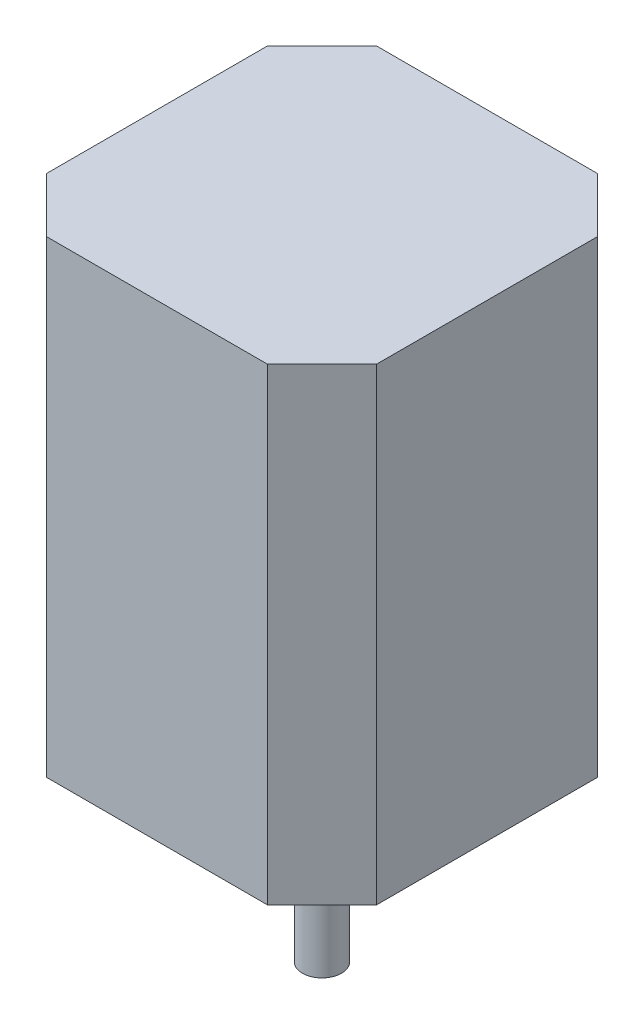
ISO-10303-21;
HEADER;
FILE_DESCRIPTION(('STEP AP214'),'2;1');
FILE_NAME('part.step','',(''),(''),'','','');
FILE_SCHEMA(('AUTOMOTIVE_DESIGN { 1 0 10303 214 1 1 1 1 }'));
ENDSEC;
DATA;
#1=APPLICATION_CONTEXT('core data for automotive mechanical design processes');
#2=APPLICATION_PROTOCOL_DEFINITION('international standard','automotive_design',2000,#1);
#3=PRODUCT_CONTEXT('',#1,'mechanical');
#4=PRODUCT('Part','Part','',(#3));
#5=PRODUCT_RELATED_PRODUCT_CATEGORY('part','',(#4));
#6=PRODUCT_DEFINITION_FORMATION('','',#4);
#7=PRODUCT_DEFINITION_CONTEXT('part definition',#1,'design');
#8=PRODUCT_DEFINITION('design','',#6,#7);
#9=PRODUCT_DEFINITION_SHAPE('','',#8);
#10=(LENGTH_UNIT() NAMED_UNIT(*) SI_UNIT(.MILLI.,.METRE.));
#11=(NAMED_UNIT(*) PLANE_ANGLE_UNIT() SI_UNIT($,.RADIAN.));
#12=(NAMED_UNIT(*) SI_UNIT($,.STERADIAN.) SOLID_ANGLE_UNIT());
#13=UNCERTAINTY_MEASURE_WITH_UNIT(LENGTH_MEASURE(1.E-05),#10,'distance_accuracy_value','');
#14=(GEOMETRIC_REPRESENTATION_CONTEXT(3) GLOBAL_UNCERTAINTY_ASSIGNED_CONTEXT((#13)) GLOBAL_UNIT_ASSIGNED_CONTEXT((#10,
#11,#12)) REPRESENTATION_CONTEXT('',''));
#15=CARTESIAN_POINT('',(0.,0.,0.));
#16=DIRECTION('',(0.,0.,1.));
#17=DIRECTION('',(1.,0.,0.));
#18=AXIS2_PLACEMENT_3D('',#15,#16,#17);
#19=CARTESIAN_POINT('',(-14.15,60.,21.15));
#20=DIRECTION('',(0.,0.,-1.));
#21=DIRECTION('',(-1.,0.,0.));
#22=AXIS2_PLACEMENT_3D('',#19,#20,#21);
#23=PLANE('',#22);
#24=DIRECTION('',(1.,0.,0.));
#25=VECTOR('',#24,1.);
#26=CARTESIAN_POINT('',(-14.15,0.,21.15));
#27=LINE('',#26,#25);
#28=CARTESIAN_POINT('',(-14.15,0.,21.15));
#29=VERTEX_POINT('',#28);
#30=CARTESIAN_POINT('',(14.15,0.,21.15));
#31=VERTEX_POINT('',#30);
#32=EDGE_CURVE('E133',#29,#31,#27,.T.);
#33=ORIENTED_EDGE('',*,*,#32,.T.);
#34=DIRECTION('',(0.,-1.,0.));
#35=VECTOR('',#34,1.);
#36=CARTESIAN_POINT('',(14.15,60.,21.15));
#37=LINE('',#36,#35);
#38=CARTESIAN_POINT('',(14.15,60.,21.15));
#39=VERTEX_POINT('',#38);
#40=EDGE_CURVE('E37',#39,#31,#37,.T.);
#41=ORIENTED_EDGE('',*,*,#40,.F.);
#42=DIRECTION('',(1.,0.,0.));
#43=VECTOR('',#42,1.);
#44=CARTESIAN_POINT('',(-14.15,60.,21.15));
#45=LINE('',#44,#43);
#46=CARTESIAN_POINT('',(-14.15,60.,21.15));
#47=VERTEX_POINT('',#46);
#48=EDGE_CURVE('E148',#47,#39,#45,.T.);
#49=ORIENTED_EDGE('',*,*,#48,.F.);
#50=DIRECTION('',(0.,-1.,0.));
#51=VECTOR('',#50,1.);
#52=CARTESIAN_POINT('',(-14.15,60.,21.15));
#53=LINE('',#52,#51);
#54=EDGE_CURVE('E129',#47,#29,#53,.T.);
#55=ORIENTED_EDGE('',*,*,#54,.T.);
#56=EDGE_LOOP('',(#33,#41,#49,#55));
#57=FACE_BOUND('',#56,.T.);
#58=ADVANCED_FACE('F34',(#57),#23,.F.);
#59=CARTESIAN_POINT('',(14.15,60.,21.15));
#60=DIRECTION('',(-0.707106781186547,0.,-0.707106781186547));
#61=DIRECTION('',(-0.707106781186548,0.,0.707106781186548));
#62=AXIS2_PLACEMENT_3D('',#59,#60,#61);
#63=PLANE('',#62);
#64=DIRECTION('',(0.707106781186547,0.,-0.707106781186547));
#65=VECTOR('',#64,1.);
#66=CARTESIAN_POINT('',(14.15,0.,21.15));
#67=LINE('',#66,#65);
#68=CARTESIAN_POINT('',(21.15,0.,14.15));
#69=VERTEX_POINT('',#68);
#70=EDGE_CURVE('E136',#31,#69,#67,.T.);
#71=ORIENTED_EDGE('',*,*,#70,.T.);
#72=DIRECTION('',(0.,-1.,0.));
#73=VECTOR('',#72,1.);
#74=CARTESIAN_POINT('',(21.15,60.,14.15));
#75=LINE('',#74,#73);
#76=CARTESIAN_POINT('',(21.15,60.,14.15));
#77=VERTEX_POINT('',#76);
#78=EDGE_CURVE('E157',#77,#69,#75,.T.);
#79=ORIENTED_EDGE('',*,*,#78,.F.);
#80=DIRECTION('',(0.707106781186547,0.,-0.707106781186547));
#81=VECTOR('',#80,1.);
#82=CARTESIAN_POINT('',(14.15,60.,21.15));
#83=LINE('',#82,#81);
#84=EDGE_CURVE('E96',#39,#77,#83,.T.);
#85=ORIENTED_EDGE('',*,*,#84,.F.);
#86=ORIENTED_EDGE('',*,*,#40,.T.);
#87=EDGE_LOOP('',(#71,#79,#85,#86));
#88=FACE_BOUND('',#87,.T.);
#89=ADVANCED_FACE('F200',(#88),#63,.F.);
#90=CARTESIAN_POINT('',(21.15,60.,14.15));
#91=DIRECTION('',(-1.,0.,0.));
#92=DIRECTION('',(0.,0.,1.));
#93=AXIS2_PLACEMENT_3D('',#90,#91,#92);
#94=PLANE('',#93);
#95=DIRECTION('',(0.,0.,-1.));
#96=VECTOR('',#95,1.);
#97=CARTESIAN_POINT('',(21.15,0.,14.15));
#98=LINE('',#97,#96);
#99=CARTESIAN_POINT('',(21.15,0.,-14.15));
#100=VERTEX_POINT('',#99);
#101=EDGE_CURVE('E139',#69,#100,#98,.T.);
#102=ORIENTED_EDGE('',*,*,#101,.T.);
#103=DIRECTION('',(0.,-1.,0.));
#104=VECTOR('',#103,1.);
#105=CARTESIAN_POINT('',(21.15,60.,-14.15));
#106=LINE('',#105,#104);
#107=CARTESIAN_POINT('',(21.15,60.,-14.15));
#108=VERTEX_POINT('',#107);
#109=EDGE_CURVE('E155',#108,#100,#106,.T.);
#110=ORIENTED_EDGE('',*,*,#109,.F.);
#111=DIRECTION('',(0.,0.,-1.));
#112=VECTOR('',#111,1.);
#113=CARTESIAN_POINT('',(21.15,60.,14.15));
#114=LINE('',#113,#112);
#115=EDGE_CURVE('E172',#77,#108,#114,.T.);
#116=ORIENTED_EDGE('',*,*,#115,.F.);
#117=ORIENTED_EDGE('',*,*,#78,.T.);
#118=EDGE_LOOP('',(#102,#110,#116,#117));
#119=FACE_BOUND('',#118,.T.);
#120=ADVANCED_FACE('F204',(#119),#94,.F.);
#121=CARTESIAN_POINT('',(14.15,60.,-21.15));
#122=DIRECTION('',(-0.707106781186547,0.,0.707106781186547));
#123=DIRECTION('',(0.707106781186548,0.,0.707106781186548));
#124=AXIS2_PLACEMENT_3D('',#121,#122,#123);
#125=PLANE('',#124);
#126=DIRECTION('',(-0.707106781186547,0.,-0.707106781186547));
#127=VECTOR('',#126,1.);
#128=CARTESIAN_POINT('',(14.15,0.,-21.15));
#129=LINE('',#128,#127);
#130=CARTESIAN_POINT('',(14.15,0.,-21.15));
#131=VERTEX_POINT('',#130);
#132=EDGE_CURVE('E141',#100,#131,#129,.T.);
#133=ORIENTED_EDGE('',*,*,#132,.T.);
#134=DIRECTION('',(0.,-1.,0.));
#135=VECTOR('',#134,1.);
#136=CARTESIAN_POINT('',(14.15,60.,-21.15));
#137=LINE('',#136,#135);
#138=CARTESIAN_POINT('',(14.15,60.,-21.15));
#139=VERTEX_POINT('',#138);
#140=EDGE_CURVE('E152',#139,#131,#137,.T.);
#141=ORIENTED_EDGE('',*,*,#140,.F.);
#142=DIRECTION('',(-0.707106781186547,0.,-0.707106781186547));
#143=VECTOR('',#142,1.);
#144=CARTESIAN_POINT('',(14.15,60.,-21.15));
#145=LINE('',#144,#143);
#146=EDGE_CURVE('E174',#108,#139,#145,.T.);
#147=ORIENTED_EDGE('',*,*,#146,.F.);
#148=ORIENTED_EDGE('',*,*,#109,.T.);
#149=EDGE_LOOP('',(#133,#141,#147,#148));
#150=FACE_BOUND('',#149,.T.);
#151=ADVANCED_FACE('F179',(#150),#125,.F.);
#152=CARTESIAN_POINT('',(-14.15,60.,-21.15));
#153=DIRECTION('',(0.,0.,1.));
#154=DIRECTION('',(1.,0.,0.));
#155=AXIS2_PLACEMENT_3D('',#152,#153,#154);
#156=PLANE('',#155);
#157=DIRECTION('',(-1.,0.,0.));
#158=VECTOR('',#157,1.);
#159=CARTESIAN_POINT('',(-14.15,0.,-21.15));
#160=LINE('',#159,#158);
#161=CARTESIAN_POINT('',(-14.15,0.,-21.15));
#162=VERTEX_POINT('',#161);
#163=EDGE_CURVE('E143',#131,#162,#160,.T.);
#164=ORIENTED_EDGE('',*,*,#163,.T.);
#165=DIRECTION('',(0.,-1.,0.));
#166=VECTOR('',#165,1.);
#167=CARTESIAN_POINT('',(-14.15,60.,-21.15));
#168=LINE('',#167,#166);
#169=CARTESIAN_POINT('',(-14.15,60.,-21.15));
#170=VERTEX_POINT('',#169);
#171=EDGE_CURVE('E124',#170,#162,#168,.T.);
#172=ORIENTED_EDGE('',*,*,#171,.F.);
#173=DIRECTION('',(-1.,0.,0.));
#174=VECTOR('',#173,1.);
#175=CARTESIAN_POINT('',(-14.15,60.,-21.15));
#176=LINE('',#175,#174);
#177=EDGE_CURVE('E115',#139,#170,#176,.T.);
#178=ORIENTED_EDGE('',*,*,#177,.F.);
#179=ORIENTED_EDGE('',*,*,#140,.T.);
#180=EDGE_LOOP('',(#164,#172,#178,#179));
#181=FACE_BOUND('',#180,.T.);
#182=ADVANCED_FACE('F183',(#181),#156,.F.);
#183=CARTESIAN_POINT('',(-21.15,60.,-14.15));
#184=DIRECTION('',(0.707106781186547,0.,0.707106781186547));
#185=DIRECTION('',(0.707106781186548,0.,-0.707106781186548));
#186=AXIS2_PLACEMENT_3D('',#183,#184,#185);
#187=PLANE('',#186);
#188=DIRECTION('',(-0.707106781186547,0.,0.707106781186547));
#189=VECTOR('',#188,1.);
#190=CARTESIAN_POINT('',(-21.15,0.,-14.15));
#191=LINE('',#190,#189);
#192=CARTESIAN_POINT('',(-21.15,0.,-14.15));
#193=VERTEX_POINT('',#192);
#194=EDGE_CURVE('E123',#162,#193,#191,.T.);
#195=ORIENTED_EDGE('',*,*,#194,.T.);
#196=DIRECTION('',(0.,-1.,0.));
#197=VECTOR('',#196,1.);
#198=CARTESIAN_POINT('',(-21.15,60.,-14.15));
#199=LINE('',#198,#197);
#200=CARTESIAN_POINT('',(-21.15,60.,-14.15));
#201=VERTEX_POINT('',#200);
#202=EDGE_CURVE('E120',#201,#193,#199,.T.);
#203=ORIENTED_EDGE('',*,*,#202,.F.);
#204=DIRECTION('',(-0.707106781186547,0.,0.707106781186547));
#205=VECTOR('',#204,1.);
#206=CARTESIAN_POINT('',(-21.15,60.,-14.15));
#207=LINE('',#206,#205);
#208=EDGE_CURVE('E109',#170,#201,#207,.T.);
#209=ORIENTED_EDGE('',*,*,#208,.F.);
#210=ORIENTED_EDGE('',*,*,#171,.T.);
#211=EDGE_LOOP('',(#195,#203,#209,#210));
#212=FACE_BOUND('',#211,.T.);
#213=ADVANCED_FACE('F121',(#212),#187,.F.);
#214=CARTESIAN_POINT('',(-21.15,60.,14.15));
#215=DIRECTION('',(1.,0.,0.));
#216=DIRECTION('',(0.,0.,-1.));
#217=AXIS2_PLACEMENT_3D('',#214,#215,#216);
#218=PLANE('',#217);
#219=DIRECTION('',(0.,0.,1.));
#220=VECTOR('',#219,1.);
#221=CARTESIAN_POINT('',(-21.15,0.,14.15));
#222=LINE('',#221,#220);
#223=CARTESIAN_POINT('',(-21.15,0.,14.15));
#224=VERTEX_POINT('',#223);
#225=EDGE_CURVE('E81',#193,#224,#222,.T.);
#226=ORIENTED_EDGE('',*,*,#225,.T.);
#227=DIRECTION('',(0.,-1.,0.));
#228=VECTOR('',#227,1.);
#229=CARTESIAN_POINT('',(-21.15,60.,14.15));
#230=LINE('',#229,#228);
#231=CARTESIAN_POINT('',(-21.15,60.,14.15));
#232=VERTEX_POINT('',#231);
#233=EDGE_CURVE('E125',#232,#224,#230,.T.);
#234=ORIENTED_EDGE('',*,*,#233,.F.);
#235=DIRECTION('',(0.,0.,1.));
#236=VECTOR('',#235,1.);
#237=CARTESIAN_POINT('',(-21.15,60.,14.15));
#238=LINE('',#237,#236);
#239=EDGE_CURVE('E113',#201,#232,#238,.T.);
#240=ORIENTED_EDGE('',*,*,#239,.F.);
#241=ORIENTED_EDGE('',*,*,#202,.T.);
#242=EDGE_LOOP('',(#226,#234,#240,#241));
#243=FACE_BOUND('',#242,.T.);
#244=ADVANCED_FACE('F127',(#243),#218,.F.);
#245=CARTESIAN_POINT('',(-21.15,60.,14.15));
#246=DIRECTION('',(0.707106781186547,0.,-0.707106781186547));
#247=DIRECTION('',(-0.707106781186548,0.,-0.707106781186548));
#248=AXIS2_PLACEMENT_3D('',#245,#246,#247);
#249=PLANE('',#248);
#250=DIRECTION('',(0.707106781186547,0.,0.707106781186547));
#251=VECTOR('',#250,1.);
#252=CARTESIAN_POINT('',(-21.15,0.,14.15));
#253=LINE('',#252,#251);
#254=EDGE_CURVE('E87',#224,#29,#253,.T.);
#255=ORIENTED_EDGE('',*,*,#254,.T.);
#256=ORIENTED_EDGE('',*,*,#54,.F.);
#257=DIRECTION('',(0.707106781186547,0.,0.707106781186547));
#258=VECTOR('',#257,1.);
#259=CARTESIAN_POINT('',(-21.15,60.,14.15));
#260=LINE('',#259,#258);
#261=EDGE_CURVE('E52',#232,#47,#260,.T.);
#262=ORIENTED_EDGE('',*,*,#261,.F.);
#263=ORIENTED_EDGE('',*,*,#233,.T.);
#264=EDGE_LOOP('',(#255,#256,#262,#263));
#265=FACE_BOUND('',#264,.T.);
#266=ADVANCED_FACE('F189',(#265),#249,.F.);
#267=CARTESIAN_POINT('',(0.,60.,0.));
#268=DIRECTION('',(0.,1.,0.));
#269=DIRECTION('',(0.,0.,1.));
#270=AXIS2_PLACEMENT_3D('',#267,#268,#269);
#271=PLANE('',#270);
#272=ORIENTED_EDGE('',*,*,#48,.T.);
#273=ORIENTED_EDGE('',*,*,#84,.T.);
#274=ORIENTED_EDGE('',*,*,#115,.T.);
#275=ORIENTED_EDGE('',*,*,#146,.T.);
#276=ORIENTED_EDGE('',*,*,#177,.T.);
#277=ORIENTED_EDGE('',*,*,#208,.T.);
#278=ORIENTED_EDGE('',*,*,#239,.T.);
#279=ORIENTED_EDGE('',*,*,#261,.T.);
#280=EDGE_LOOP('',(#272,#273,#274,#275,#276,#277,#278,#279));
#281=FACE_BOUND('',#280,.T.);
#282=ADVANCED_FACE('F111',(#281),#271,.T.);
#283=CARTESIAN_POINT('',(0.,0.,0.));
#284=DIRECTION('',(0.,1.,0.));
#285=DIRECTION('',(0.,0.,1.));
#286=AXIS2_PLACEMENT_3D('',#283,#284,#285);
#287=PLANE('',#286);
#288=CARTESIAN_POINT('',(-15.5,0.,15.5));
#289=DIRECTION('',(0.,-1.,0.));
#290=DIRECTION('',(0.,0.,-1.));
#291=AXIS2_PLACEMENT_3D('',#288,#289,#290);
#292=CIRCLE('',#291,1.50000000000011);
#293=CARTESIAN_POINT('',(-15.5,0.,13.9999999999999));
#294=VERTEX_POINT('',#293);
#295=EDGE_CURVE('E368',#294,#294,#292,.T.);
#296=ORIENTED_EDGE('',*,*,#295,.F.);
#297=EDGE_LOOP('',(#296));
#298=FACE_BOUND('',#297,.T.);
#299=CARTESIAN_POINT('',(-15.5,0.,-15.5));
#300=DIRECTION('',(0.,-1.,0.));
#301=DIRECTION('',(0.,0.,-1.));
#302=AXIS2_PLACEMENT_3D('',#299,#300,#301);
#303=CIRCLE('',#302,1.50000000000007);
#304=CARTESIAN_POINT('',(-15.5,0.,-17.0000000000001));
#305=VERTEX_POINT('',#304);
#306=EDGE_CURVE('E384',#305,#305,#303,.T.);
#307=ORIENTED_EDGE('',*,*,#306,.F.);
#308=EDGE_LOOP('',(#307));
#309=FACE_BOUND('',#308,.T.);
#310=CARTESIAN_POINT('',(15.5,0.,-15.5));
#311=DIRECTION('',(0.,-1.,0.));
#312=DIRECTION('',(0.,0.,-1.));
#313=AXIS2_PLACEMENT_3D('',#310,#311,#312);
#314=CIRCLE('',#313,1.50000000000004);
#315=CARTESIAN_POINT('',(15.5,0.,-17.));
#316=VERTEX_POINT('',#315);
#317=EDGE_CURVE('E378',#316,#316,#314,.T.);
#318=ORIENTED_EDGE('',*,*,#317,.F.);
#319=EDGE_LOOP('',(#318));
#320=FACE_BOUND('',#319,.T.);
#321=CARTESIAN_POINT('',(15.5,0.,15.5));
#322=DIRECTION('',(0.,-1.,0.));
#323=DIRECTION('',(0.,0.,-1.));
#324=AXIS2_PLACEMENT_3D('',#321,#322,#323);
#325=CIRCLE('',#324,1.5);
#326=CARTESIAN_POINT('',(15.5,0.,14.));
#327=VERTEX_POINT('',#326);
#328=EDGE_CURVE('E377',#327,#327,#325,.T.);
#329=ORIENTED_EDGE('',*,*,#328,.F.);
#330=EDGE_LOOP('',(#329));
#331=FACE_BOUND('',#330,.T.);
#332=CARTESIAN_POINT('',(0.,0.,0.));
#333=DIRECTION('',(0.,-1.,0.));
#334=DIRECTION('',(0.,0.,-1.));
#335=AXIS2_PLACEMENT_3D('',#332,#333,#334);
#336=CIRCLE('',#335,11.);
#337=CARTESIAN_POINT('',(0.,0.,-11.));
#338=VERTEX_POINT('',#337);
#339=EDGE_CURVE('E43',#338,#338,#336,.T.);
#340=ORIENTED_EDGE('',*,*,#339,.F.);
#341=EDGE_LOOP('',(#340));
#342=FACE_BOUND('',#341,.T.);
#343=ORIENTED_EDGE('',*,*,#32,.F.);
#344=ORIENTED_EDGE('',*,*,#254,.F.);
#345=ORIENTED_EDGE('',*,*,#225,.F.);
#346=ORIENTED_EDGE('',*,*,#194,.F.);
#347=ORIENTED_EDGE('',*,*,#163,.F.);
#348=ORIENTED_EDGE('',*,*,#132,.F.);
#349=ORIENTED_EDGE('',*,*,#101,.F.);
#350=ORIENTED_EDGE('',*,*,#70,.F.);
#351=EDGE_LOOP('',(#343,#344,#345,#346,#347,#348,#349,#350));
#352=FACE_BOUND('',#351,.T.);
#353=ADVANCED_FACE('F186',(#298,#309,#320,#331,#342,#352),#287,.F.);
#354=CARTESIAN_POINT('',(0.,-2.,0.));
#355=DIRECTION('',(0.,1.,0.));
#356=DIRECTION('',(0.,0.,1.));
#357=AXIS2_PLACEMENT_3D('',#354,#355,#356);
#358=CYLINDRICAL_SURFACE('',#357,11.);
#359=CARTESIAN_POINT('',(0.,-2.,0.));
#360=DIRECTION('',(0.,-1.,0.));
#361=DIRECTION('',(0.,0.,-1.));
#362=AXIS2_PLACEMENT_3D('',#359,#360,#361);
#363=CIRCLE('',#362,11.);
#364=CARTESIAN_POINT('',(0.,-2.,-11.));
#365=VERTEX_POINT('',#364);
#366=EDGE_CURVE('E137',#365,#365,#363,.T.);
#367=ORIENTED_EDGE('',*,*,#366,.F.);
#368=EDGE_LOOP('',(#367));
#369=FACE_BOUND('',#368,.T.);
#370=ORIENTED_EDGE('',*,*,#339,.T.);
#371=EDGE_LOOP('',(#370));
#372=FACE_BOUND('',#371,.T.);
#373=ADVANCED_FACE('F240',(#369,#372),#358,.T.);
#374=CARTESIAN_POINT('',(0.,-2.,0.));
#375=DIRECTION('',(0.,-1.,0.));
#376=DIRECTION('',(0.,0.,-1.));
#377=AXIS2_PLACEMENT_3D('',#374,#375,#376);
#378=PLANE('',#377);
#379=CARTESIAN_POINT('',(0.,-2.,0.));
#380=DIRECTION('',(0.,-1.,0.));
#381=DIRECTION('',(0.,0.,-1.));
#382=AXIS2_PLACEMENT_3D('',#379,#380,#381);
#383=CIRCLE('',#382,2.5);
#384=CARTESIAN_POINT('',(0.,-2.,-2.5));
#385=VERTEX_POINT('',#384);
#386=EDGE_CURVE('E11',#385,#385,#383,.T.);
#387=ORIENTED_EDGE('',*,*,#386,.F.);
#388=EDGE_LOOP('',(#387));
#389=FACE_BOUND('',#388,.T.);
#390=ORIENTED_EDGE('',*,*,#366,.T.);
#391=EDGE_LOOP('',(#390));
#392=FACE_BOUND('',#391,.T.);
#393=ADVANCED_FACE('F245',(#389,#392),#378,.T.);
#394=CARTESIAN_POINT('',(15.5,4.5,15.5));
#395=DIRECTION('',(0.,-1.,0.));
#396=DIRECTION('',(0.,0.,-1.));
#397=AXIS2_PLACEMENT_3D('',#394,#395,#396);
#398=CYLINDRICAL_SURFACE('',#397,1.5);
#399=CARTESIAN_POINT('',(15.5,4.5,15.5));
#400=DIRECTION('',(0.,-1.,0.));
#401=DIRECTION('',(0.,0.,-1.));
#402=AXIS2_PLACEMENT_3D('',#399,#400,#401);
#403=CIRCLE('',#402,1.5);
#404=CARTESIAN_POINT('',(15.5,4.5,14.));
#405=VERTEX_POINT('',#404);
#406=EDGE_CURVE('E389',#405,#405,#403,.T.);
#407=ORIENTED_EDGE('',*,*,#406,.F.);
#408=EDGE_LOOP('',(#407));
#409=FACE_BOUND('',#408,.T.);
#410=ORIENTED_EDGE('',*,*,#328,.T.);
#411=EDGE_LOOP('',(#410));
#412=FACE_BOUND('',#411,.T.);
#413=ADVANCED_FACE('F259',(#409,#412),#398,.F.);
#414=CARTESIAN_POINT('',(15.5,4.5,15.5));
#415=DIRECTION('',(0.,-1.,0.));
#416=DIRECTION('',(0.,0.,-1.));
#417=AXIS2_PLACEMENT_3D('',#414,#415,#416);
#418=PLANE('',#417);
#419=ORIENTED_EDGE('',*,*,#406,.T.);
#420=EDGE_LOOP('',(#419));
#421=FACE_BOUND('',#420,.T.);
#422=ADVANCED_FACE('F264',(#421),#418,.T.);
#423=CARTESIAN_POINT('',(15.5,4.5,-15.5));
#424=DIRECTION('',(0.,-1.,0.));
#425=DIRECTION('',(0.,0.,-1.));
#426=AXIS2_PLACEMENT_3D('',#423,#424,#425);
#427=CYLINDRICAL_SURFACE('',#426,1.50000000000004);
#428=CARTESIAN_POINT('',(15.5,4.5,-15.5));
#429=DIRECTION('',(0.,-1.,0.));
#430=DIRECTION('',(0.,0.,-1.));
#431=AXIS2_PLACEMENT_3D('',#428,#429,#430);
#432=CIRCLE('',#431,1.50000000000004);
#433=CARTESIAN_POINT('',(15.5,4.5,-17.));
#434=VERTEX_POINT('',#433);
#435=EDGE_CURVE('E374',#434,#434,#432,.T.);
#436=ORIENTED_EDGE('',*,*,#435,.F.);
#437=EDGE_LOOP('',(#436));
#438=FACE_BOUND('',#437,.T.);
#439=ORIENTED_EDGE('',*,*,#317,.T.);
#440=EDGE_LOOP('',(#439));
#441=FACE_BOUND('',#440,.T.);
#442=ADVANCED_FACE('F274',(#438,#441),#427,.F.);
#443=CARTESIAN_POINT('',(15.5,4.5,-15.5));
#444=DIRECTION('',(0.,-1.,0.));
#445=DIRECTION('',(0.,0.,-1.));
#446=AXIS2_PLACEMENT_3D('',#443,#444,#445);
#447=PLANE('',#446);
#448=ORIENTED_EDGE('',*,*,#435,.T.);
#449=EDGE_LOOP('',(#448));
#450=FACE_BOUND('',#449,.T.);
#451=ADVANCED_FACE('F284',(#450),#447,.T.);
#452=CARTESIAN_POINT('',(-15.5,4.5,-15.5));
#453=DIRECTION('',(0.,-1.,0.));
#454=DIRECTION('',(0.,0.,-1.));
#455=AXIS2_PLACEMENT_3D('',#452,#453,#454);
#456=CYLINDRICAL_SURFACE('',#455,1.50000000000007);
#457=CARTESIAN_POINT('',(-15.5,4.5,-15.5));
#458=DIRECTION('',(0.,-1.,0.));
#459=DIRECTION('',(0.,0.,-1.));
#460=AXIS2_PLACEMENT_3D('',#457,#458,#459);
#461=CIRCLE('',#460,1.50000000000007);
#462=CARTESIAN_POINT('',(-15.5,4.5,-17.0000000000001));
#463=VERTEX_POINT('',#462);
#464=EDGE_CURVE('E381',#463,#463,#461,.T.);
#465=ORIENTED_EDGE('',*,*,#464,.F.);
#466=EDGE_LOOP('',(#465));
#467=FACE_BOUND('',#466,.T.);
#468=ORIENTED_EDGE('',*,*,#306,.T.);
#469=EDGE_LOOP('',(#468));
#470=FACE_BOUND('',#469,.T.);
#471=ADVANCED_FACE('F294',(#467,#470),#456,.F.);
#472=CARTESIAN_POINT('',(-15.5,4.5,-15.5));
#473=DIRECTION('',(0.,-1.,0.));
#474=DIRECTION('',(0.,0.,-1.));
#475=AXIS2_PLACEMENT_3D('',#472,#473,#474);
#476=PLANE('',#475);
#477=ORIENTED_EDGE('',*,*,#464,.T.);
#478=EDGE_LOOP('',(#477));
#479=FACE_BOUND('',#478,.T.);
#480=ADVANCED_FACE('F304',(#479),#476,.T.);
#481=CARTESIAN_POINT('',(-15.5,4.5,15.5));
#482=DIRECTION('',(0.,-1.,0.));
#483=DIRECTION('',(0.,0.,-1.));
#484=AXIS2_PLACEMENT_3D('',#481,#482,#483);
#485=CYLINDRICAL_SURFACE('',#484,1.50000000000011);
#486=CARTESIAN_POINT('',(-15.5,4.5,15.5));
#487=DIRECTION('',(0.,-1.,0.));
#488=DIRECTION('',(0.,0.,-1.));
#489=AXIS2_PLACEMENT_3D('',#486,#487,#488);
#490=CIRCLE('',#489,1.50000000000011);
#491=CARTESIAN_POINT('',(-15.5,4.5,13.9999999999999));
#492=VERTEX_POINT('',#491);
#493=EDGE_CURVE('E371',#492,#492,#490,.T.);
#494=ORIENTED_EDGE('',*,*,#493,.F.);
#495=EDGE_LOOP('',(#494));
#496=FACE_BOUND('',#495,.T.);
#497=ORIENTED_EDGE('',*,*,#295,.T.);
#498=EDGE_LOOP('',(#497));
#499=FACE_BOUND('',#498,.T.);
#500=ADVANCED_FACE('F314',(#496,#499),#485,.F.);
#501=CARTESIAN_POINT('',(-15.5,4.5,15.5));
#502=DIRECTION('',(0.,-1.,0.));
#503=DIRECTION('',(0.,0.,-1.));
#504=AXIS2_PLACEMENT_3D('',#501,#502,#503);
#505=PLANE('',#504);
#506=ORIENTED_EDGE('',*,*,#493,.T.);
#507=EDGE_LOOP('',(#506));
#508=FACE_BOUND('',#507,.T.);
#509=ADVANCED_FACE('F324',(#508),#505,.T.);
#510=CARTESIAN_POINT('',(0.,-24.,0.));
#511=DIRECTION('',(0.,1.,0.));
#512=DIRECTION('',(0.,0.,1.));
#513=AXIS2_PLACEMENT_3D('',#510,#511,#512);
#514=CYLINDRICAL_SURFACE('',#513,2.5);
#515=CARTESIAN_POINT('',(0.,-24.,0.));
#516=DIRECTION('',(0.,-1.,0.));
#517=DIRECTION('',(0.,0.,-1.));
#518=AXIS2_PLACEMENT_3D('',#515,#516,#517);
#519=CIRCLE('',#518,2.5);
#520=CARTESIAN_POINT('',(0.,-24.,-2.5));
#521=VERTEX_POINT('',#520);
#522=EDGE_CURVE('E367',#521,#521,#519,.T.);
#523=ORIENTED_EDGE('',*,*,#522,.F.);
#524=EDGE_LOOP('',(#523));
#525=FACE_BOUND('',#524,.T.);
#526=ORIENTED_EDGE('',*,*,#386,.T.);
#527=EDGE_LOOP('',(#526));
#528=FACE_BOUND('',#527,.T.);
#529=ADVANCED_FACE('F334',(#525,#528),#514,.T.);
#530=CARTESIAN_POINT('',(0.,-24.,0.));
#531=DIRECTION('',(0.,-1.,0.));
#532=DIRECTION('',(0.,0.,-1.));
#533=AXIS2_PLACEMENT_3D('',#530,#531,#532);
#534=PLANE('',#533);
#535=ORIENTED_EDGE('',*,*,#522,.T.);
#536=EDGE_LOOP('',(#535));
#537=FACE_BOUND('',#536,.T.);
#538=ADVANCED_FACE('F351',(#537),#534,.T.);
#539=CLOSED_SHELL('',(#58,#89,#120,#151,#182,#213,#244,#266,#282,#353,#373,#393,#413,#422,#442,
#451,#471,#480,#500,#509,#529,#538));
#540=MANIFOLD_SOLID_BREP('B2',#539);
#541=ADVANCED_BREP_SHAPE_REPRESENTATION('',(#18,#540),#14);
#542=SHAPE_DEFINITION_REPRESENTATION(#9,#541);
ENDSEC;
END-ISO-10303-21;
